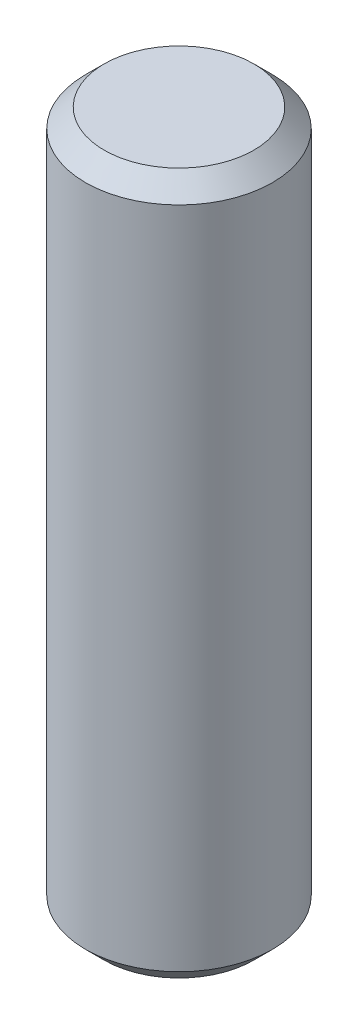
ISO-10303-21;
HEADER;
FILE_DESCRIPTION(('STEP AP214'),'2;1');
FILE_NAME('part.step','',(''),(''),'','','');
FILE_SCHEMA(('AUTOMOTIVE_DESIGN { 1 0 10303 214 1 1 1 1 }'));
ENDSEC;
DATA;
#1=APPLICATION_CONTEXT('core data for automotive mechanical design processes');
#2=APPLICATION_PROTOCOL_DEFINITION('international standard','automotive_design',2000,#1);
#3=PRODUCT_CONTEXT('',#1,'mechanical');
#4=PRODUCT('Part','Part','',(#3));
#5=PRODUCT_RELATED_PRODUCT_CATEGORY('part','',(#4));
#6=PRODUCT_DEFINITION_FORMATION('','',#4);
#7=PRODUCT_DEFINITION_CONTEXT('part definition',#1,'design');
#8=PRODUCT_DEFINITION('design','',#6,#7);
#9=PRODUCT_DEFINITION_SHAPE('','',#8);
#10=(LENGTH_UNIT() NAMED_UNIT(*) SI_UNIT(.MILLI.,.METRE.));
#11=(NAMED_UNIT(*) PLANE_ANGLE_UNIT() SI_UNIT($,.RADIAN.));
#12=(NAMED_UNIT(*) SI_UNIT($,.STERADIAN.) SOLID_ANGLE_UNIT());
#13=UNCERTAINTY_MEASURE_WITH_UNIT(LENGTH_MEASURE(1.E-05),#10,'distance_accuracy_value','');
#14=(GEOMETRIC_REPRESENTATION_CONTEXT(3) GLOBAL_UNCERTAINTY_ASSIGNED_CONTEXT((#13)) GLOBAL_UNIT_ASSIGNED_CONTEXT((#10,
#11,#12)) REPRESENTATION_CONTEXT('',''));
#15=CARTESIAN_POINT('',(0.,0.,0.));
#16=DIRECTION('',(0.,0.,1.));
#17=DIRECTION('',(1.,0.,0.));
#18=AXIS2_PLACEMENT_3D('',#15,#16,#17);
#19=CARTESIAN_POINT('',(0.,19.9106347953167,0.));
#20=DIRECTION('',(0.,-1.,0.));
#21=DIRECTION('',(0.,0.,-1.));
#22=AXIS2_PLACEMENT_3D('',#19,#20,#21);
#23=PLANE('',#22);
#24=CARTESIAN_POINT('',(0.,19.9106347953167,0.));
#25=DIRECTION('',(0.,-1.,0.));
#26=DIRECTION('',(0.,0.,-1.));
#27=AXIS2_PLACEMENT_3D('',#24,#25,#26);
#28=CIRCLE('',#27,8.00000000000001);
#29=CARTESIAN_POINT('',(0.,19.9106347953167,-8.00000000000001));
#30=VERTEX_POINT('',#29);
#31=EDGE_CURVE('E10',#30,#30,#28,.F.);
#32=ORIENTED_EDGE('',*,*,#31,.T.);
#33=EDGE_LOOP('',(#32));
#34=FACE_BOUND('',#33,.T.);
#35=ADVANCED_FACE('F39',(#34),#23,.F.);
#36=CARTESIAN_POINT('',(0.,25.8100821420772,0.));
#37=DIRECTION('',(0.,1.,0.));
#38=DIRECTION('',(0.,0.,1.));
#39=AXIS2_PLACEMENT_3D('',#36,#37,#38);
#40=CYLINDRICAL_SURFACE('',#39,10.);
#41=CARTESIAN_POINT('',(0.,-53.0893652046833,0.));
#42=DIRECTION('',(0.,1.,0.));
#43=DIRECTION('',(0.,0.,1.));
#44=AXIS2_PLACEMENT_3D('',#41,#42,#43);
#45=CIRCLE('',#44,10.);
#46=CARTESIAN_POINT('',(0.,-53.0893652046833,10.));
#47=VERTEX_POINT('',#46);
#48=EDGE_CURVE('E51',#47,#47,#45,.T.);
#49=ORIENTED_EDGE('',*,*,#48,.T.);
#50=EDGE_LOOP('',(#49));
#51=FACE_BOUND('',#50,.T.);
#52=CARTESIAN_POINT('',(0.,17.9106347953167,0.));
#53=DIRECTION('',(0.,-1.,0.));
#54=DIRECTION('',(0.,0.,-1.));
#55=AXIS2_PLACEMENT_3D('',#52,#53,#54);
#56=CIRCLE('',#55,10.);
#57=CARTESIAN_POINT('',(0.,17.9106347953167,-10.));
#58=VERTEX_POINT('',#57);
#59=EDGE_CURVE('E55',#58,#58,#56,.T.);
#60=ORIENTED_EDGE('',*,*,#59,.T.);
#61=EDGE_LOOP('',(#60));
#62=FACE_BOUND('',#61,.T.);
#63=ADVANCED_FACE('F61',(#51,#62),#40,.T.);
#64=CARTESIAN_POINT('',(10.,-55.0893652046833,0.));
#65=DIRECTION('',(0.,1.,0.));
#66=DIRECTION('',(0.,0.,1.));
#67=AXIS2_PLACEMENT_3D('',#64,#65,#66);
#68=PLANE('',#67);
#69=CARTESIAN_POINT('',(0.,-55.0893652046833,0.));
#70=DIRECTION('',(0.,1.,0.));
#71=DIRECTION('',(0.,0.,1.));
#72=AXIS2_PLACEMENT_3D('',#69,#70,#71);
#73=CIRCLE('',#72,8.00000000000001);
#74=CARTESIAN_POINT('',(0.,-55.0893652046833,8.00000000000001));
#75=VERTEX_POINT('',#74);
#76=EDGE_CURVE('E47',#75,#75,#73,.F.);
#77=ORIENTED_EDGE('',*,*,#76,.T.);
#78=EDGE_LOOP('',(#77));
#79=FACE_BOUND('',#78,.T.);
#80=ADVANCED_FACE('F69',(#79),#68,.F.);
#81=CARTESIAN_POINT('',(0.,-53.0893652046833,0.));
#82=DIRECTION('',(0.,1.,0.));
#83=DIRECTION('',(0.,0.,1.));
#84=AXIS2_PLACEMENT_3D('',#81,#82,#83);
#85=CONICAL_SURFACE('',#84,10.,0.785398163397451);
#86=ORIENTED_EDGE('',*,*,#76,.F.);
#87=EDGE_LOOP('',(#86));
#88=FACE_BOUND('',#87,.T.);
#89=ORIENTED_EDGE('',*,*,#48,.F.);
#90=EDGE_LOOP('',(#89));
#91=FACE_BOUND('',#90,.T.);
#92=ADVANCED_FACE('F65',(#88,#91),#85,.T.);
#93=CARTESIAN_POINT('',(0.,19.9106347953167,0.));
#94=DIRECTION('',(0.,-1.,0.));
#95=DIRECTION('',(0.,0.,-1.));
#96=AXIS2_PLACEMENT_3D('',#93,#94,#95);
#97=CONICAL_SURFACE('',#96,8.00000000000001,0.785398163397445);
#98=ORIENTED_EDGE('',*,*,#59,.F.);
#99=EDGE_LOOP('',(#98));
#100=FACE_BOUND('',#99,.T.);
#101=ORIENTED_EDGE('',*,*,#31,.F.);
#102=EDGE_LOOP('',(#101));
#103=FACE_BOUND('',#102,.T.);
#104=ADVANCED_FACE('F42',(#100,#103),#97,.T.);
#105=CLOSED_SHELL('',(#35,#63,#80,#92,#104));
#106=MANIFOLD_SOLID_BREP('B2',#105);
#107=ADVANCED_BREP_SHAPE_REPRESENTATION('',(#18,#106),#14);
#108=SHAPE_DEFINITION_REPRESENTATION(#9,#107);
ENDSEC;
END-ISO-10303-21;
